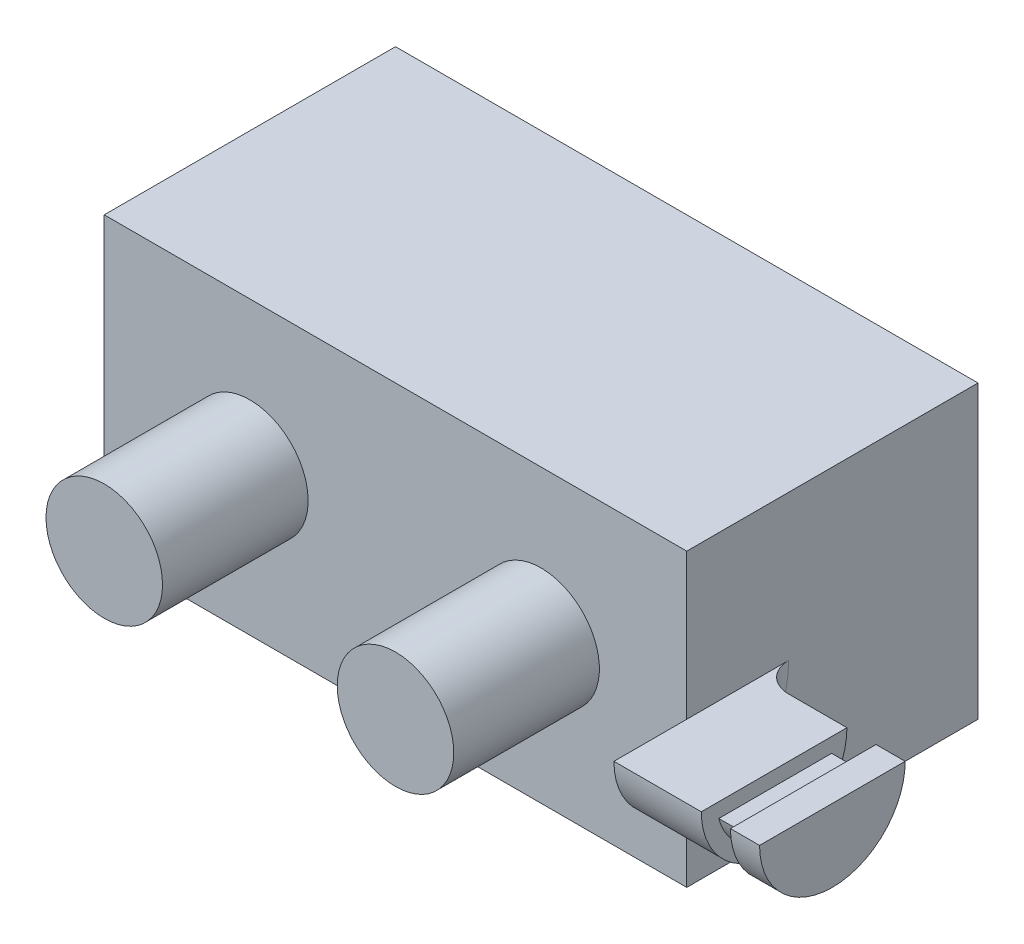
ISO-10303-21;
HEADER;
FILE_DESCRIPTION(('STEP AP214'),'2;1');
FILE_NAME('part.step','',(''),(''),'','','');
FILE_SCHEMA(('AUTOMOTIVE_DESIGN { 1 0 10303 214 1 1 1 1 }'));
ENDSEC;
DATA;
#1=APPLICATION_CONTEXT('core data for automotive mechanical design processes');
#2=APPLICATION_PROTOCOL_DEFINITION('international standard','automotive_design',2000,#1);
#3=PRODUCT_CONTEXT('',#1,'mechanical');
#4=PRODUCT('Part','Part','',(#3));
#5=PRODUCT_RELATED_PRODUCT_CATEGORY('part','',(#4));
#6=PRODUCT_DEFINITION_FORMATION('','',#4);
#7=PRODUCT_DEFINITION_CONTEXT('part definition',#1,'design');
#8=PRODUCT_DEFINITION('design','',#6,#7);
#9=PRODUCT_DEFINITION_SHAPE('','',#8);
#10=(LENGTH_UNIT() NAMED_UNIT(*) SI_UNIT(.MILLI.,.METRE.));
#11=(NAMED_UNIT(*) PLANE_ANGLE_UNIT() SI_UNIT($,.RADIAN.));
#12=(NAMED_UNIT(*) SI_UNIT($,.STERADIAN.) SOLID_ANGLE_UNIT());
#13=UNCERTAINTY_MEASURE_WITH_UNIT(LENGTH_MEASURE(1.E-05),#10,'distance_accuracy_value','');
#14=(GEOMETRIC_REPRESENTATION_CONTEXT(3) GLOBAL_UNCERTAINTY_ASSIGNED_CONTEXT((#13)) GLOBAL_UNIT_ASSIGNED_CONTEXT((#10,
#11,#12)) REPRESENTATION_CONTEXT('',''));
#15=CARTESIAN_POINT('',(0.,0.,0.));
#16=DIRECTION('',(0.,0.,1.));
#17=DIRECTION('',(1.,0.,0.));
#18=AXIS2_PLACEMENT_3D('',#15,#16,#17);
#19=CARTESIAN_POINT('',(63.5,12.7,0.));
#20=DIRECTION('',(-1.,0.,0.));
#21=DIRECTION('',(0.,0.,1.));
#22=AXIS2_PLACEMENT_3D('',#19,#20,#21);
#23=CYLINDRICAL_SURFACE('',#22,6.35);
#24=CARTESIAN_POINT('',(50.8,12.7,0.));
#25=DIRECTION('',(-1.,0.,0.));
#26=DIRECTION('',(0.,0.,1.));
#27=AXIS2_PLACEMENT_3D('',#24,#25,#26);
#28=CIRCLE('',#27,6.35);
#29=CARTESIAN_POINT('',(50.8,6.35,0.));
#30=VERTEX_POINT('',#29);
#31=CARTESIAN_POINT('',(50.8,12.7,6.35));
#32=VERTEX_POINT('',#31);
#33=EDGE_CURVE('E169',#30,#32,#28,.T.);
#34=ORIENTED_EDGE('',*,*,#33,.F.);
#35=DIRECTION('',(-1.,0.,0.));
#36=VECTOR('',#35,1.);
#37=CARTESIAN_POINT('',(50.8,6.35,0.));
#38=LINE('',#37,#36);
#39=CARTESIAN_POINT('',(53.34,6.35,0.));
#40=VERTEX_POINT('',#39);
#41=EDGE_CURVE('E55',#30,#40,#38,.F.);
#42=ORIENTED_EDGE('',*,*,#41,.T.);
#43=CARTESIAN_POINT('',(53.34,12.7,0.));
#44=DIRECTION('',(-1.,0.,0.));
#45=DIRECTION('',(0.,0.,1.));
#46=AXIS2_PLACEMENT_3D('',#43,#44,#45);
#47=CIRCLE('',#46,6.35);
#48=CARTESIAN_POINT('',(53.34,12.7,-6.35));
#49=VERTEX_POINT('',#48);
#50=EDGE_CURVE('E265',#40,#49,#47,.F.);
#51=ORIENTED_EDGE('',*,*,#50,.T.);
#52=DIRECTION('',(-1.,0.,0.));
#53=VECTOR('',#52,1.);
#54=CARTESIAN_POINT('',(63.5,12.7,-6.35));
#55=LINE('',#54,#53);
#56=CARTESIAN_POINT('',(58.42,12.7,-6.35));
#57=VERTEX_POINT('',#56);
#58=EDGE_CURVE('E197',#57,#49,#55,.T.);
#59=ORIENTED_EDGE('',*,*,#58,.F.);
#60=CARTESIAN_POINT('',(58.42,12.7,0.));
#61=DIRECTION('',(1.,0.,0.));
#62=DIRECTION('',(0.,0.,-1.));
#63=AXIS2_PLACEMENT_3D('',#60,#61,#62);
#64=CIRCLE('',#63,6.35);
#65=CARTESIAN_POINT('',(58.42,12.7,6.35));
#66=VERTEX_POINT('',#65);
#67=EDGE_CURVE('E162',#66,#57,#64,.T.);
#68=ORIENTED_EDGE('',*,*,#67,.F.);
#69=DIRECTION('',(-1.,0.,0.));
#70=VECTOR('',#69,1.);
#71=CARTESIAN_POINT('',(63.5,12.7,6.35));
#72=LINE('',#71,#70);
#73=EDGE_CURVE('E184',#66,#32,#72,.T.);
#74=ORIENTED_EDGE('',*,*,#73,.T.);
#75=EDGE_LOOP('',(#34,#42,#51,#59,#68,#74));
#76=FACE_BOUND('',#75,.T.);
#77=ADVANCED_FACE('F39',(#76),#23,.T.);
#78=CARTESIAN_POINT('',(63.5,12.7,0.));
#79=DIRECTION('',(0.,-1.,0.));
#80=DIRECTION('',(0.,0.,-1.));
#81=AXIS2_PLACEMENT_3D('',#78,#79,#80);
#82=PLANE('',#81);
#83=DIRECTION('',(0.,0.,1.));
#84=VECTOR('',#83,1.);
#85=CARTESIAN_POINT('',(58.42,12.7,6.35));
#86=LINE('',#85,#84);
#87=EDGE_CURVE('E165',#57,#66,#86,.T.);
#88=ORIENTED_EDGE('',*,*,#87,.F.);
#89=ORIENTED_EDGE('',*,*,#58,.T.);
#90=CARTESIAN_POINT('',(53.34,12.7,-8.89));
#91=DIRECTION('',(0.,-1.,0.));
#92=DIRECTION('',(0.,0.,-1.));
#93=AXIS2_PLACEMENT_3D('',#90,#91,#92);
#94=CIRCLE('',#93,2.54);
#95=CARTESIAN_POINT('',(50.8,12.7,-8.89));
#96=VERTEX_POINT('',#95);
#97=EDGE_CURVE('E11',#49,#96,#94,.T.);
#98=ORIENTED_EDGE('',*,*,#97,.T.);
#99=DIRECTION('',(0.,0.,1.));
#100=VECTOR('',#99,1.);
#101=CARTESIAN_POINT('',(50.8,12.7,0.));
#102=LINE('',#101,#100);
#103=CARTESIAN_POINT('',(50.8,12.7,0.));
#104=VERTEX_POINT('',#103);
#105=EDGE_CURVE('E181',#96,#104,#102,.T.);
#106=ORIENTED_EDGE('',*,*,#105,.T.);
#107=EDGE_CURVE('E188',#104,#32,#102,.T.);
#108=ORIENTED_EDGE('',*,*,#107,.T.);
#109=ORIENTED_EDGE('',*,*,#73,.F.);
#110=EDGE_LOOP('',(#88,#89,#98,#106,#108,#109));
#111=FACE_BOUND('',#110,.T.);
#112=ADVANCED_FACE('F282',(#111),#82,.F.);
#113=CARTESIAN_POINT('',(0.,25.4,0.));
#114=DIRECTION('',(1.,0.,0.));
#115=DIRECTION('',(0.,0.,-1.));
#116=AXIS2_PLACEMENT_3D('',#113,#114,#115);
#117=PLANE('',#116);
#118=DIRECTION('',(0.,0.,1.));
#119=VECTOR('',#118,1.);
#120=CARTESIAN_POINT('',(0.,0.,0.));
#121=LINE('',#120,#119);
#122=CARTESIAN_POINT('',(0.,0.,-25.4));
#123=VERTEX_POINT('',#122);
#124=CARTESIAN_POINT('',(0.,0.,0.));
#125=VERTEX_POINT('',#124);
#126=EDGE_CURVE('E209',#123,#125,#121,.T.);
#127=ORIENTED_EDGE('',*,*,#126,.T.);
#128=DIRECTION('',(0.,-1.,0.));
#129=VECTOR('',#128,1.);
#130=CARTESIAN_POINT('',(0.,25.4,0.));
#131=LINE('',#130,#129);
#132=CARTESIAN_POINT('',(0.,25.4,0.));
#133=VERTEX_POINT('',#132);
#134=EDGE_CURVE('E248',#133,#125,#131,.T.);
#135=ORIENTED_EDGE('',*,*,#134,.F.);
#136=DIRECTION('',(0.,0.,1.));
#137=VECTOR('',#136,1.);
#138=CARTESIAN_POINT('',(0.,25.4,0.));
#139=LINE('',#138,#137);
#140=CARTESIAN_POINT('',(0.,25.4,-25.4));
#141=VERTEX_POINT('',#140);
#142=EDGE_CURVE('E210',#141,#133,#139,.T.);
#143=ORIENTED_EDGE('',*,*,#142,.F.);
#144=DIRECTION('',(0.,-1.,0.));
#145=VECTOR('',#144,1.);
#146=CARTESIAN_POINT('',(0.,25.4,-25.4));
#147=LINE('',#146,#145);
#148=EDGE_CURVE('E224',#141,#123,#147,.T.);
#149=ORIENTED_EDGE('',*,*,#148,.T.);
#150=EDGE_LOOP('',(#127,#135,#143,#149));
#151=FACE_BOUND('',#150,.T.);
#152=ADVANCED_FACE('F312',(#151),#117,.F.);
#153=CARTESIAN_POINT('',(0.,25.4,0.));
#154=DIRECTION('',(0.,0.,-1.));
#155=DIRECTION('',(-1.,0.,0.));
#156=AXIS2_PLACEMENT_3D('',#153,#154,#155);
#157=PLANE('',#156);
#158=CARTESIAN_POINT('',(38.1,12.7,0.));
#159=DIRECTION('',(0.,0.,-1.));
#160=DIRECTION('',(-1.,0.,0.));
#161=AXIS2_PLACEMENT_3D('',#158,#159,#160);
#162=CIRCLE('',#161,5.08);
#163=CARTESIAN_POINT('',(33.02,12.7,0.));
#164=VERTEX_POINT('',#163);
#165=EDGE_CURVE('E257',#164,#164,#162,.F.);
#166=ORIENTED_EDGE('',*,*,#165,.F.);
#167=EDGE_LOOP('',(#166));
#168=FACE_BOUND('',#167,.T.);
#169=CARTESIAN_POINT('',(12.7,12.7,0.));
#170=DIRECTION('',(0.,0.,-1.));
#171=DIRECTION('',(-1.,0.,0.));
#172=AXIS2_PLACEMENT_3D('',#169,#170,#171);
#173=CIRCLE('',#172,5.08);
#174=CARTESIAN_POINT('',(7.62,12.7,0.));
#175=VERTEX_POINT('',#174);
#176=EDGE_CURVE('E253',#175,#175,#173,.F.);
#177=ORIENTED_EDGE('',*,*,#176,.F.);
#178=EDGE_LOOP('',(#177));
#179=FACE_BOUND('',#178,.T.);
#180=DIRECTION('',(1.,0.,0.));
#181=VECTOR('',#180,1.);
#182=CARTESIAN_POINT('',(0.,0.,0.));
#183=LINE('',#182,#181);
#184=CARTESIAN_POINT('',(50.8,0.,0.));
#185=VERTEX_POINT('',#184);
#186=EDGE_CURVE('E228',#125,#185,#183,.T.);
#187=ORIENTED_EDGE('',*,*,#186,.T.);
#188=DIRECTION('',(0.,-1.,0.));
#189=VECTOR('',#188,1.);
#190=CARTESIAN_POINT('',(50.8,25.4,0.));
#191=LINE('',#190,#189);
#192=CARTESIAN_POINT('',(50.8,3.81,0.));
#193=VERTEX_POINT('',#192);
#194=EDGE_CURVE('E244',#193,#185,#191,.T.);
#195=ORIENTED_EDGE('',*,*,#194,.F.);
#196=CARTESIAN_POINT('',(53.34,3.81,0.));
#197=DIRECTION('',(0.,0.,-1.));
#198=DIRECTION('',(-1.,0.,0.));
#199=AXIS2_PLACEMENT_3D('',#196,#197,#198);
#200=CIRCLE('',#199,2.54);
#201=EDGE_CURVE('E48',#193,#40,#200,.T.);
#202=ORIENTED_EDGE('',*,*,#201,.T.);
#203=ORIENTED_EDGE('',*,*,#41,.F.);
#204=EDGE_CURVE('E249',#104,#30,#191,.T.);
#205=ORIENTED_EDGE('',*,*,#204,.F.);
#206=CARTESIAN_POINT('',(50.8,25.4,0.));
#207=VERTEX_POINT('',#206);
#208=EDGE_CURVE('E245',#207,#104,#191,.T.);
#209=ORIENTED_EDGE('',*,*,#208,.F.);
#210=DIRECTION('',(1.,0.,0.));
#211=VECTOR('',#210,1.);
#212=CARTESIAN_POINT('',(0.,25.4,0.));
#213=LINE('',#212,#211);
#214=EDGE_CURVE('E214',#133,#207,#213,.T.);
#215=ORIENTED_EDGE('',*,*,#214,.F.);
#216=ORIENTED_EDGE('',*,*,#134,.T.);
#217=EDGE_LOOP('',(#187,#195,#202,#203,#205,#209,#215,#216));
#218=FACE_BOUND('',#217,.T.);
#219=ADVANCED_FACE('F294',(#168,#179,#218),#157,.F.);
#220=CARTESIAN_POINT('',(50.8,25.4,0.));
#221=DIRECTION('',(-1.,0.,0.));
#222=DIRECTION('',(0.,0.,1.));
#223=AXIS2_PLACEMENT_3D('',#220,#221,#222);
#224=PLANE('',#223);
#225=ORIENTED_EDGE('',*,*,#105,.F.);
#226=CARTESIAN_POINT('',(50.8,12.7,0.));
#227=DIRECTION('',(-1.,0.,0.));
#228=DIRECTION('',(0.,0.,1.));
#229=AXIS2_PLACEMENT_3D('',#226,#227,#228);
#230=CIRCLE('',#229,8.89);
#231=EDGE_CURVE('E261',#96,#193,#230,.T.);
#232=ORIENTED_EDGE('',*,*,#231,.T.);
#233=ORIENTED_EDGE('',*,*,#194,.T.);
#234=DIRECTION('',(0.,0.,-1.));
#235=VECTOR('',#234,1.);
#236=CARTESIAN_POINT('',(50.8,0.,0.));
#237=LINE('',#236,#235);
#238=CARTESIAN_POINT('',(50.8,0.,-25.4));
#239=VERTEX_POINT('',#238);
#240=EDGE_CURVE('E232',#185,#239,#237,.T.);
#241=ORIENTED_EDGE('',*,*,#240,.T.);
#242=DIRECTION('',(0.,-1.,0.));
#243=VECTOR('',#242,1.);
#244=CARTESIAN_POINT('',(50.8,25.4,-25.4));
#245=LINE('',#244,#243);
#246=CARTESIAN_POINT('',(50.8,25.4,-25.4));
#247=VERTEX_POINT('',#246);
#248=EDGE_CURVE('E240',#247,#239,#245,.T.);
#249=ORIENTED_EDGE('',*,*,#248,.F.);
#250=DIRECTION('',(0.,0.,-1.));
#251=VECTOR('',#250,1.);
#252=CARTESIAN_POINT('',(50.8,25.4,0.));
#253=LINE('',#252,#251);
#254=EDGE_CURVE('E218',#207,#247,#253,.T.);
#255=ORIENTED_EDGE('',*,*,#254,.F.);
#256=ORIENTED_EDGE('',*,*,#208,.T.);
#257=EDGE_LOOP('',(#225,#232,#233,#241,#249,#255,#256));
#258=FACE_BOUND('',#257,.T.);
#259=ADVANCED_FACE('F293',(#258),#224,.F.);
#260=CARTESIAN_POINT('',(0.,25.4,-25.4));
#261=DIRECTION('',(0.,0.,1.));
#262=DIRECTION('',(1.,0.,0.));
#263=AXIS2_PLACEMENT_3D('',#260,#261,#262);
#264=PLANE('',#263);
#265=DIRECTION('',(-1.,0.,0.));
#266=VECTOR('',#265,1.);
#267=CARTESIAN_POINT('',(0.,0.,-25.4));
#268=LINE('',#267,#266);
#269=EDGE_CURVE('E215',#239,#123,#268,.T.);
#270=ORIENTED_EDGE('',*,*,#269,.T.);
#271=ORIENTED_EDGE('',*,*,#148,.F.);
#272=DIRECTION('',(-1.,0.,0.));
#273=VECTOR('',#272,1.);
#274=CARTESIAN_POINT('',(0.,25.4,-25.4));
#275=LINE('',#274,#273);
#276=EDGE_CURVE('E221',#247,#141,#275,.T.);
#277=ORIENTED_EDGE('',*,*,#276,.F.);
#278=ORIENTED_EDGE('',*,*,#248,.T.);
#279=EDGE_LOOP('',(#270,#271,#277,#278));
#280=FACE_BOUND('',#279,.T.);
#281=ADVANCED_FACE('F305',(#280),#264,.F.);
#282=CARTESIAN_POINT('',(0.,25.4,0.));
#283=DIRECTION('',(0.,-1.,0.));
#284=DIRECTION('',(0.,0.,-1.));
#285=AXIS2_PLACEMENT_3D('',#282,#283,#284);
#286=PLANE('',#285);
#287=ORIENTED_EDGE('',*,*,#142,.T.);
#288=ORIENTED_EDGE('',*,*,#214,.T.);
#289=ORIENTED_EDGE('',*,*,#254,.T.);
#290=ORIENTED_EDGE('',*,*,#276,.T.);
#291=EDGE_LOOP('',(#287,#288,#289,#290));
#292=FACE_BOUND('',#291,.T.);
#293=ADVANCED_FACE('F309',(#292),#286,.F.);
#294=CARTESIAN_POINT('',(0.,0.,0.));
#295=DIRECTION('',(0.,-1.,0.));
#296=DIRECTION('',(0.,0.,-1.));
#297=AXIS2_PLACEMENT_3D('',#294,#295,#296);
#298=PLANE('',#297);
#299=ORIENTED_EDGE('',*,*,#126,.F.);
#300=ORIENTED_EDGE('',*,*,#269,.F.);
#301=ORIENTED_EDGE('',*,*,#240,.F.);
#302=ORIENTED_EDGE('',*,*,#186,.F.);
#303=EDGE_LOOP('',(#299,#300,#301,#302));
#304=FACE_BOUND('',#303,.T.);
#305=ADVANCED_FACE('F300',(#304),#298,.T.);
#306=CARTESIAN_POINT('',(12.7,12.7,12.7));
#307=DIRECTION('',(0.,0.,-1.));
#308=DIRECTION('',(-1.,0.,0.));
#309=AXIS2_PLACEMENT_3D('',#306,#307,#308);
#310=CYLINDRICAL_SURFACE('',#309,5.08);
#311=CARTESIAN_POINT('',(12.7,12.7,12.7));
#312=DIRECTION('',(0.,0.,1.));
#313=DIRECTION('',(1.,0.,0.));
#314=AXIS2_PLACEMENT_3D('',#311,#312,#313);
#315=CIRCLE('',#314,5.08);
#316=CARTESIAN_POINT('',(17.78,12.7,12.7));
#317=VERTEX_POINT('',#316);
#318=EDGE_CURVE('E205',#317,#317,#315,.T.);
#319=ORIENTED_EDGE('',*,*,#318,.F.);
#320=EDGE_LOOP('',(#319));
#321=FACE_BOUND('',#320,.T.);
#322=ORIENTED_EDGE('',*,*,#176,.T.);
#323=EDGE_LOOP('',(#322));
#324=FACE_BOUND('',#323,.T.);
#325=ADVANCED_FACE('F368',(#321,#324),#310,.T.);
#326=CARTESIAN_POINT('',(12.7,12.7,12.7));
#327=DIRECTION('',(0.,0.,1.));
#328=DIRECTION('',(1.,0.,0.));
#329=AXIS2_PLACEMENT_3D('',#326,#327,#328);
#330=PLANE('',#329);
#331=ORIENTED_EDGE('',*,*,#318,.T.);
#332=EDGE_LOOP('',(#331));
#333=FACE_BOUND('',#332,.T.);
#334=ADVANCED_FACE('F362',(#333),#330,.T.);
#335=CARTESIAN_POINT('',(38.1,12.7,12.7));
#336=DIRECTION('',(0.,0.,-1.));
#337=DIRECTION('',(-1.,0.,0.));
#338=AXIS2_PLACEMENT_3D('',#335,#336,#337);
#339=CYLINDRICAL_SURFACE('',#338,5.08);
#340=CARTESIAN_POINT('',(38.1,12.7,12.7));
#341=DIRECTION('',(0.,0.,1.));
#342=DIRECTION('',(1.,0.,0.));
#343=AXIS2_PLACEMENT_3D('',#340,#341,#342);
#344=CIRCLE('',#343,5.08);
#345=CARTESIAN_POINT('',(43.18,12.7,12.7));
#346=VERTEX_POINT('',#345);
#347=EDGE_CURVE('E196',#346,#346,#344,.T.);
#348=ORIENTED_EDGE('',*,*,#347,.F.);
#349=EDGE_LOOP('',(#348));
#350=FACE_BOUND('',#349,.T.);
#351=ORIENTED_EDGE('',*,*,#165,.T.);
#352=EDGE_LOOP('',(#351));
#353=FACE_BOUND('',#352,.T.);
#354=ADVANCED_FACE('F357',(#350,#353),#339,.T.);
#355=CARTESIAN_POINT('',(38.1,12.7,12.7));
#356=DIRECTION('',(0.,0.,1.));
#357=DIRECTION('',(1.,0.,0.));
#358=AXIS2_PLACEMENT_3D('',#355,#356,#357);
#359=PLANE('',#358);
#360=ORIENTED_EDGE('',*,*,#347,.T.);
#361=EDGE_LOOP('',(#360));
#362=FACE_BOUND('',#361,.T.);
#363=ADVANCED_FACE('F352',(#362),#359,.T.);
#364=CARTESIAN_POINT('',(50.8,12.7,0.));
#365=DIRECTION('',(-1.,0.,0.));
#366=DIRECTION('',(0.,0.,1.));
#367=AXIS2_PLACEMENT_3D('',#364,#365,#366);
#368=PLANE('',#367);
#369=ORIENTED_EDGE('',*,*,#107,.F.);
#370=ORIENTED_EDGE('',*,*,#204,.T.);
#371=ORIENTED_EDGE('',*,*,#33,.T.);
#372=EDGE_LOOP('',(#369,#370,#371));
#373=FACE_BOUND('',#372,.T.);
#374=ADVANCED_FACE('F284',(#373),#368,.T.);
#375=CARTESIAN_POINT('',(58.42,12.7,0.));
#376=DIRECTION('',(1.,0.,0.));
#377=DIRECTION('',(0.,0.,-1.));
#378=AXIS2_PLACEMENT_3D('',#375,#376,#377);
#379=PLANE('',#378);
#380=DIRECTION('',(0.,0.,1.));
#381=VECTOR('',#380,1.);
#382=CARTESIAN_POINT('',(58.42,11.43,4.82485462635279));
#383=LINE('',#382,#381);
#384=CARTESIAN_POINT('',(58.42,11.43,-5.01252307301404));
#385=VERTEX_POINT('',#384);
#386=CARTESIAN_POINT('',(58.42,11.43,4.82485462635279));
#387=VERTEX_POINT('',#386);
#388=EDGE_CURVE('E134',#385,#387,#383,.T.);
#389=ORIENTED_EDGE('',*,*,#388,.F.);
#390=CARTESIAN_POINT('',(58.42,12.7,-0.0938342233306241));
#391=DIRECTION('',(1.,0.,0.));
#392=DIRECTION('',(0.,0.,-1.));
#393=AXIS2_PLACEMENT_3D('',#390,#391,#392);
#394=CIRCLE('',#393,5.08);
#395=EDGE_CURVE('E146',#387,#385,#394,.T.);
#396=ORIENTED_EDGE('',*,*,#395,.F.);
#397=EDGE_LOOP('',(#389,#396));
#398=FACE_BOUND('',#397,.T.);
#399=ORIENTED_EDGE('',*,*,#67,.T.);
#400=ORIENTED_EDGE('',*,*,#87,.T.);
#401=EDGE_LOOP('',(#399,#400));
#402=FACE_BOUND('',#401,.T.);
#403=ADVANCED_FACE('F144',(#398,#402),#379,.T.);
#404=CARTESIAN_POINT('',(60.96,12.7,0.));
#405=DIRECTION('',(1.,0.,0.));
#406=DIRECTION('',(0.,0.,-1.));
#407=AXIS2_PLACEMENT_3D('',#404,#405,#406);
#408=PLANE('',#407);
#409=CARTESIAN_POINT('',(60.96,12.7,-0.0938342233306241));
#410=DIRECTION('',(1.,0.,0.));
#411=DIRECTION('',(0.,0.,-1.));
#412=AXIS2_PLACEMENT_3D('',#409,#410,#411);
#413=CIRCLE('',#412,5.08);
#414=CARTESIAN_POINT('',(60.96,11.43,4.82485462635279));
#415=VERTEX_POINT('',#414);
#416=CARTESIAN_POINT('',(60.96,11.43,-5.01252307301404));
#417=VERTEX_POINT('',#416);
#418=EDGE_CURVE('E154',#415,#417,#413,.T.);
#419=ORIENTED_EDGE('',*,*,#418,.T.);
#420=DIRECTION('',(0.,0.,1.));
#421=VECTOR('',#420,1.);
#422=CARTESIAN_POINT('',(60.96,11.43,4.82485462635279));
#423=LINE('',#422,#421);
#424=EDGE_CURVE('E136',#417,#415,#423,.T.);
#425=ORIENTED_EDGE('',*,*,#424,.T.);
#426=EDGE_LOOP('',(#419,#425));
#427=FACE_BOUND('',#426,.T.);
#428=CARTESIAN_POINT('',(60.96,12.7,0.));
#429=DIRECTION('',(1.,0.,0.));
#430=DIRECTION('',(0.,0.,-1.));
#431=AXIS2_PLACEMENT_3D('',#428,#429,#430);
#432=CIRCLE('',#431,6.35);
#433=CARTESIAN_POINT('',(60.96,12.7,6.35));
#434=VERTEX_POINT('',#433);
#435=CARTESIAN_POINT('',(60.96,12.7,-6.35));
#436=VERTEX_POINT('',#435);
#437=EDGE_CURVE('E160',#434,#436,#432,.T.);
#438=ORIENTED_EDGE('',*,*,#437,.F.);
#439=DIRECTION('',(0.,0.,1.));
#440=VECTOR('',#439,1.);
#441=CARTESIAN_POINT('',(60.96,12.7,6.35));
#442=LINE('',#441,#440);
#443=EDGE_CURVE('E166',#436,#434,#442,.T.);
#444=ORIENTED_EDGE('',*,*,#443,.F.);
#445=EDGE_LOOP('',(#438,#444));
#446=FACE_BOUND('',#445,.T.);
#447=ADVANCED_FACE('F349',(#427,#446),#408,.F.);
#448=CARTESIAN_POINT('',(58.42,12.7,-0.0938342233306241));
#449=DIRECTION('',(1.,0.,0.));
#450=DIRECTION('',(0.,0.,-1.));
#451=AXIS2_PLACEMENT_3D('',#448,#449,#450);
#452=CYLINDRICAL_SURFACE('',#451,5.08);
#453=ORIENTED_EDGE('',*,*,#418,.F.);
#454=DIRECTION('',(1.,0.,0.));
#455=VECTOR('',#454,1.);
#456=CARTESIAN_POINT('',(58.42,11.43,4.82485462635279));
#457=LINE('',#456,#455);
#458=EDGE_CURVE('E141',#387,#415,#457,.T.);
#459=ORIENTED_EDGE('',*,*,#458,.F.);
#460=ORIENTED_EDGE('',*,*,#395,.T.);
#461=DIRECTION('',(1.,0.,0.));
#462=VECTOR('',#461,1.);
#463=CARTESIAN_POINT('',(58.42,11.43,-5.01252307301404));
#464=LINE('',#463,#462);
#465=EDGE_CURVE('E131',#385,#417,#464,.T.);
#466=ORIENTED_EDGE('',*,*,#465,.T.);
#467=EDGE_LOOP('',(#453,#459,#460,#466));
#468=FACE_BOUND('',#467,.T.);
#469=ADVANCED_FACE('F150',(#468),#452,.T.);
#470=CARTESIAN_POINT('',(58.42,11.43,4.82485462635279));
#471=DIRECTION('',(0.,1.,0.));
#472=DIRECTION('',(0.,0.,1.));
#473=AXIS2_PLACEMENT_3D('',#470,#471,#472);
#474=PLANE('',#473);
#475=ORIENTED_EDGE('',*,*,#424,.F.);
#476=ORIENTED_EDGE('',*,*,#465,.F.);
#477=ORIENTED_EDGE('',*,*,#388,.T.);
#478=ORIENTED_EDGE('',*,*,#458,.T.);
#479=EDGE_LOOP('',(#475,#476,#477,#478));
#480=FACE_BOUND('',#479,.T.);
#481=ADVANCED_FACE('F133',(#480),#474,.T.);
#482=CARTESIAN_POINT('',(63.5,12.7,0.));
#483=DIRECTION('',(-1.,0.,0.));
#484=DIRECTION('',(0.,0.,1.));
#485=AXIS2_PLACEMENT_3D('',#482,#483,#484);
#486=PLANE('',#485);
#487=CARTESIAN_POINT('',(63.5,12.7,0.));
#488=DIRECTION('',(-1.,0.,0.));
#489=DIRECTION('',(0.,0.,1.));
#490=AXIS2_PLACEMENT_3D('',#487,#488,#489);
#491=CIRCLE('',#490,6.35);
#492=CARTESIAN_POINT('',(63.5,12.7,-6.35));
#493=VERTEX_POINT('',#492);
#494=CARTESIAN_POINT('',(63.5,12.7,6.35));
#495=VERTEX_POINT('',#494);
#496=EDGE_CURVE('E176',#493,#495,#491,.T.);
#497=ORIENTED_EDGE('',*,*,#496,.F.);
#498=DIRECTION('',(0.,0.,1.));
#499=VECTOR('',#498,1.);
#500=CARTESIAN_POINT('',(63.5,12.7,0.));
#501=LINE('',#500,#499);
#502=EDGE_CURVE('E180',#493,#495,#501,.T.);
#503=ORIENTED_EDGE('',*,*,#502,.T.);
#504=EDGE_LOOP('',(#497,#503));
#505=FACE_BOUND('',#504,.T.);
#506=ADVANCED_FACE('F334',(#505),#486,.F.);
#507=EDGE_CURVE('E192',#493,#436,#55,.T.);
#508=ORIENTED_EDGE('',*,*,#507,.T.);
#509=ORIENTED_EDGE('',*,*,#443,.T.);
#510=EDGE_CURVE('E198',#495,#434,#72,.T.);
#511=ORIENTED_EDGE('',*,*,#510,.F.);
#512=ORIENTED_EDGE('',*,*,#502,.F.);
#513=EDGE_LOOP('',(#508,#509,#511,#512));
#514=FACE_BOUND('',#513,.T.);
#515=ADVANCED_FACE('F321',(#514),#82,.F.);
#516=ORIENTED_EDGE('',*,*,#437,.T.);
#517=ORIENTED_EDGE('',*,*,#507,.F.);
#518=ORIENTED_EDGE('',*,*,#496,.T.);
#519=ORIENTED_EDGE('',*,*,#510,.T.);
#520=EDGE_LOOP('',(#516,#517,#518,#519));
#521=FACE_BOUND('',#520,.T.);
#522=ADVANCED_FACE('F324',(#521),#23,.T.);
#523=CARTESIAN_POINT('',(53.34,12.7,0.));
#524=DIRECTION('',(-1.,0.,0.));
#525=DIRECTION('',(0.,0.,1.));
#526=AXIS2_PLACEMENT_3D('',#523,#524,#525);
#527=TOROIDAL_SURFACE('',#526,8.89,2.54);
#528=ORIENTED_EDGE('',*,*,#97,.F.);
#529=ORIENTED_EDGE('',*,*,#50,.F.);
#530=ORIENTED_EDGE('',*,*,#201,.F.);
#531=ORIENTED_EDGE('',*,*,#231,.F.);
#532=EDGE_LOOP('',(#528,#529,#530,#531));
#533=FACE_BOUND('',#532,.T.);
#534=ADVANCED_FACE('F41',(#533),#527,.F.);
#535=CLOSED_SHELL('',(#77,#112,#152,#219,#259,#281,#293,#305,#325,#334,#354,#363,#374,#403,#447,
#469,#481,#506,#515,#522,#534));
#536=MANIFOLD_SOLID_BREP('B2',#535);
#537=ADVANCED_BREP_SHAPE_REPRESENTATION('',(#18,#536),#14);
#538=SHAPE_DEFINITION_REPRESENTATION(#9,#537);
ENDSEC;
END-ISO-10303-21;
